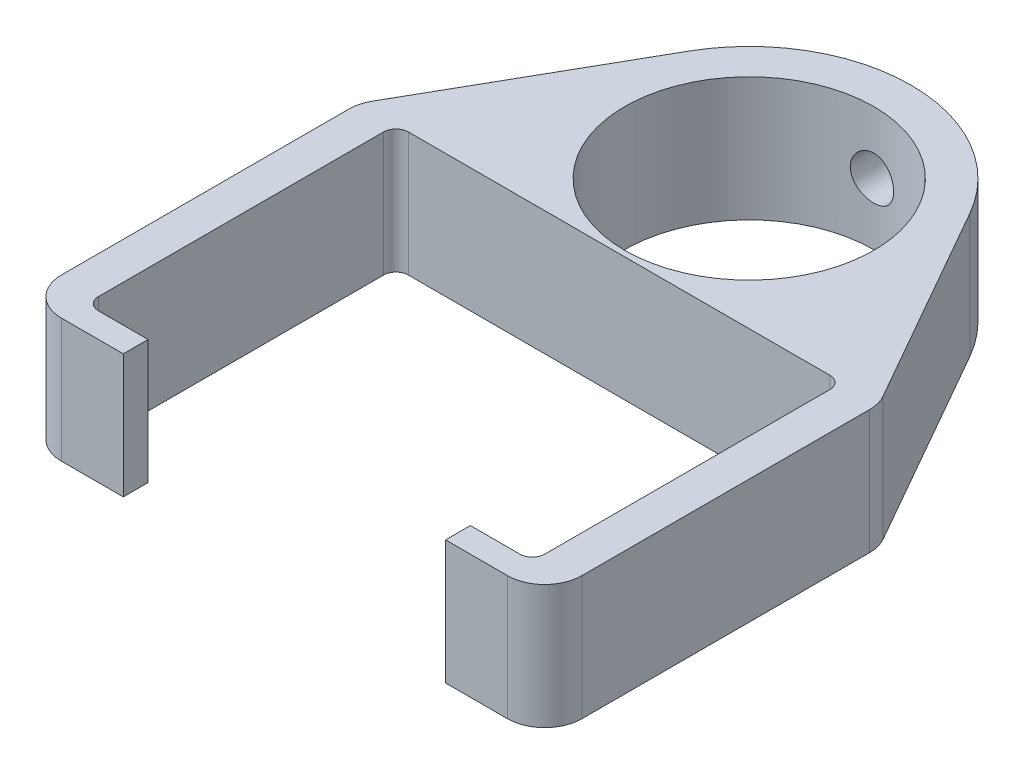
ISO-10303-21;
HEADER;
FILE_DESCRIPTION(('STEP AP214'),'2;1');
FILE_NAME('part.step','',(''),(''),'','','');
FILE_SCHEMA(('AUTOMOTIVE_DESIGN { 1 0 10303 214 1 1 1 1 }'));
ENDSEC;
DATA;
#1=APPLICATION_CONTEXT('core data for automotive mechanical design processes');
#2=APPLICATION_PROTOCOL_DEFINITION('international standard','automotive_design',2000,#1);
#3=PRODUCT_CONTEXT('',#1,'mechanical');
#4=PRODUCT('Part','Part','',(#3));
#5=PRODUCT_RELATED_PRODUCT_CATEGORY('part','',(#4));
#6=PRODUCT_DEFINITION_FORMATION('','',#4);
#7=PRODUCT_DEFINITION_CONTEXT('part definition',#1,'design');
#8=PRODUCT_DEFINITION('design','',#6,#7);
#9=PRODUCT_DEFINITION_SHAPE('','',#8);
#10=(LENGTH_UNIT() NAMED_UNIT(*) SI_UNIT(.MILLI.,.METRE.));
#11=(NAMED_UNIT(*) PLANE_ANGLE_UNIT() SI_UNIT($,.RADIAN.));
#12=(NAMED_UNIT(*) SI_UNIT($,.STERADIAN.) SOLID_ANGLE_UNIT());
#13=UNCERTAINTY_MEASURE_WITH_UNIT(LENGTH_MEASURE(1.E-05),#10,'distance_accuracy_value','');
#14=(GEOMETRIC_REPRESENTATION_CONTEXT(3) GLOBAL_UNCERTAINTY_ASSIGNED_CONTEXT((#13)) GLOBAL_UNIT_ASSIGNED_CONTEXT((#10,
#11,#12)) REPRESENTATION_CONTEXT('',''));
#15=CARTESIAN_POINT('',(0.,0.,0.));
#16=DIRECTION('',(0.,0.,1.));
#17=DIRECTION('',(1.,0.,0.));
#18=AXIS2_PLACEMENT_3D('',#15,#16,#17);
#19=CARTESIAN_POINT('',(18.,10.,0.));
#20=DIRECTION('',(1.,0.,0.));
#21=DIRECTION('',(0.,0.,-1.));
#22=AXIS2_PLACEMENT_3D('',#19,#20,#21);
#23=PLANE('',#22);
#24=DIRECTION('',(0.,0.,1.));
#25=VECTOR('',#24,1.);
#26=CARTESIAN_POINT('',(18.,0.,0.));
#27=LINE('',#26,#25);
#28=CARTESIAN_POINT('',(18.,0.,11.5));
#29=VERTEX_POINT('',#28);
#30=CARTESIAN_POINT('',(18.,0.,34.5));
#31=VERTEX_POINT('',#30);
#32=EDGE_CURVE('E324',#29,#31,#27,.T.);
#33=ORIENTED_EDGE('',*,*,#32,.T.);
#34=DIRECTION('',(0.,-1.,0.));
#35=VECTOR('',#34,1.);
#36=CARTESIAN_POINT('',(18.,10.,34.5));
#37=LINE('',#36,#35);
#38=CARTESIAN_POINT('',(18.,10.,34.5));
#39=VERTEX_POINT('',#38);
#40=EDGE_CURVE('E393',#31,#39,#37,.F.);
#41=ORIENTED_EDGE('',*,*,#40,.T.);
#42=DIRECTION('',(0.,0.,1.));
#43=VECTOR('',#42,1.);
#44=CARTESIAN_POINT('',(18.,10.,0.));
#45=LINE('',#44,#43);
#46=CARTESIAN_POINT('',(18.,10.,11.5));
#47=VERTEX_POINT('',#46);
#48=EDGE_CURVE('E291',#47,#39,#45,.T.);
#49=ORIENTED_EDGE('',*,*,#48,.F.);
#50=DIRECTION('',(0.,-1.,0.));
#51=VECTOR('',#50,1.);
#52=CARTESIAN_POINT('',(18.,0.,11.5));
#53=LINE('',#52,#51);
#54=EDGE_CURVE('E390',#47,#29,#53,.T.);
#55=ORIENTED_EDGE('',*,*,#54,.T.);
#56=EDGE_LOOP('',(#33,#41,#49,#55));
#57=FACE_BOUND('',#56,.T.);
#58=ADVANCED_FACE('F86',(#57),#23,.F.);
#59=CARTESIAN_POINT('',(21.,10.,0.));
#60=DIRECTION('',(1.,0.,0.));
#61=DIRECTION('',(0.,0.,-1.));
#62=AXIS2_PLACEMENT_3D('',#59,#60,#61);
#63=PLANE('',#62);
#64=DIRECTION('',(0.,0.,1.));
#65=VECTOR('',#64,1.);
#66=CARTESIAN_POINT('',(21.,10.,0.));
#67=LINE('',#66,#65);
#68=CARTESIAN_POINT('',(21.,10.,11.2945265569492));
#69=VERTEX_POINT('',#68);
#70=CARTESIAN_POINT('',(21.,10.,34.5));
#71=VERTEX_POINT('',#70);
#72=EDGE_CURVE('E255',#69,#71,#67,.T.);
#73=ORIENTED_EDGE('',*,*,#72,.T.);
#74=DIRECTION('',(0.,-1.,0.));
#75=VECTOR('',#74,1.);
#76=CARTESIAN_POINT('',(21.,10.,34.5));
#77=LINE('',#76,#75);
#78=CARTESIAN_POINT('',(21.,0.,34.5));
#79=VERTEX_POINT('',#78);
#80=EDGE_CURVE('E355',#71,#79,#77,.T.);
#81=ORIENTED_EDGE('',*,*,#80,.T.);
#82=DIRECTION('',(0.,0.,1.));
#83=VECTOR('',#82,1.);
#84=CARTESIAN_POINT('',(21.,0.,0.));
#85=LINE('',#84,#83);
#86=CARTESIAN_POINT('',(21.,0.,11.2945265569492));
#87=VERTEX_POINT('',#86);
#88=EDGE_CURVE('E300',#87,#79,#85,.T.);
#89=ORIENTED_EDGE('',*,*,#88,.F.);
#90=DIRECTION('',(0.,-1.,0.));
#91=VECTOR('',#90,1.);
#92=CARTESIAN_POINT('',(21.,10.,11.2945265569492));
#93=LINE('',#92,#91);
#94=EDGE_CURVE('E265',#87,#69,#93,.F.);
#95=ORIENTED_EDGE('',*,*,#94,.T.);
#96=EDGE_LOOP('',(#73,#81,#89,#95));
#97=FACE_BOUND('',#96,.T.);
#98=ADVANCED_FACE('F464',(#97),#63,.T.);
#99=CARTESIAN_POINT('',(11.3393007104556,10.,-6.45931570662559));
#100=DIRECTION('',(-0.868911931835682,0.,0.494966720814221));
#101=DIRECTION('',(0.494966720814221,0.,0.868911931835682));
#102=AXIS2_PLACEMENT_3D('',#99,#100,#101);
#103=PLANE('',#102);
#104=DIRECTION('',(-0.494966720814221,0.,-0.868911931835682));
#105=VECTOR('',#104,1.);
#106=CARTESIAN_POINT('',(11.3393007104556,10.,-6.45931570662559));
#107=LINE('',#106,#105);
#108=CARTESIAN_POINT('',(20.606735795507,10.,9.80962639450653));
#109=VERTEX_POINT('',#108);
#110=CARTESIAN_POINT('',(11.3393007104556,10.,-6.45931570662559));
#111=VERTEX_POINT('',#110);
#112=EDGE_CURVE('E240',#109,#111,#107,.T.);
#113=ORIENTED_EDGE('',*,*,#112,.F.);
#114=DIRECTION('',(0.,-1.,0.));
#115=VECTOR('',#114,1.);
#116=CARTESIAN_POINT('',(20.606735795507,0.,9.80962639450653));
#117=LINE('',#116,#115);
#118=CARTESIAN_POINT('',(20.606735795507,0.,9.80962639450653));
#119=VERTEX_POINT('',#118);
#120=EDGE_CURVE('E383',#109,#119,#117,.T.);
#121=ORIENTED_EDGE('',*,*,#120,.T.);
#122=DIRECTION('',(-0.494966720814221,0.,-0.868911931835682));
#123=VECTOR('',#122,1.);
#124=CARTESIAN_POINT('',(11.3393007104556,0.,-6.45931570662559));
#125=LINE('',#124,#123);
#126=CARTESIAN_POINT('',(11.3393007104556,0.,-6.45931570662559));
#127=VERTEX_POINT('',#126);
#128=EDGE_CURVE('E261',#119,#127,#125,.T.);
#129=ORIENTED_EDGE('',*,*,#128,.T.);
#130=DIRECTION('',(0.,-1.,0.));
#131=VECTOR('',#130,1.);
#132=CARTESIAN_POINT('',(11.3393007104556,10.,-6.45931570662559));
#133=LINE('',#132,#131);
#134=EDGE_CURVE('E258',#111,#127,#133,.T.);
#135=ORIENTED_EDGE('',*,*,#134,.F.);
#136=EDGE_LOOP('',(#113,#121,#129,#135));
#137=FACE_BOUND('',#136,.T.);
#138=ADVANCED_FACE('F259',(#137),#103,.F.);
#139=CARTESIAN_POINT('',(0.,10.,0.));
#140=DIRECTION('',(0.,-1.,0.));
#141=DIRECTION('',(0.,0.,-1.));
#142=AXIS2_PLACEMENT_3D('',#139,#140,#141);
#143=CYLINDRICAL_SURFACE('',#142,13.05);
#144=CARTESIAN_POINT('',(0.,3.25,-13.05));
#145=CARTESIAN_POINT('',(0.0978274017965709,3.25000411727674,-13.0499985563924));
#146=CARTESIAN_POINT('',(0.195714439800495,3.25823070004055,-13.0488883898653));
#147=CARTESIAN_POINT('',(0.388760454522384,3.29091590878211,-13.0445665203212));
#148=CARTESIAN_POINT('',(0.483916545257474,3.31539109129607,-13.0413526738031));
#149=CARTESIAN_POINT('',(0.668678315046049,3.37983583069083,-13.0331851953373));
#150=CARTESIAN_POINT('',(0.758287837663679,3.41979451546337,-13.0282327843927));
#151=CARTESIAN_POINT('',(0.92951350904582,3.51404720199481,-13.017137756471));
#152=CARTESIAN_POINT('',(1.01113093590114,3.56833890647693,-13.01099533027));
#153=CARTESIAN_POINT('',(1.16458562397635,3.69008166801,-12.9981618599946));
#154=CARTESIAN_POINT('',(1.23636526187491,3.75760506080751,-12.9914679230641));
#155=CARTESIAN_POINT('',(1.36761021823294,3.90373897923181,-12.9783089667916));
#156=CARTESIAN_POINT('',(1.42707488253316,3.98235009345475,-12.9718439596253));
#157=CARTESIAN_POINT('',(1.5322200474085,4.148807040605,-12.9598465684176));
#158=CARTESIAN_POINT('',(1.57784592653884,4.2366876682978,-12.954317917093));
#159=CARTESIAN_POINT('',(1.65366947077376,4.41895068503637,-12.9448579047174));
#160=CARTESIAN_POINT('',(1.68386780784691,4.51333279069775,-12.9409264740987));
#161=CARTESIAN_POINT('',(1.72780254414692,4.70531852783656,-12.9351339943286));
#162=CARTESIAN_POINT('',(1.74163675133164,4.80289939900467,-12.9332606489036));
#163=CARTESIAN_POINT('',(1.75275329817794,4.99901430170584,-12.9317589374786));
#164=CARTESIAN_POINT('',(1.75003640072308,5.09754828909828,-12.9321304680064));
#165=CARTESIAN_POINT('',(1.72820802453727,5.29208759906491,-12.9350652782109));
#166=CARTESIAN_POINT('',(1.70920469200651,5.38810530549202,-12.9376140997407));
#167=CARTESIAN_POINT('',(1.65551180644757,5.57557663636558,-12.9445937446439));
#168=CARTESIAN_POINT('',(1.62082189199352,5.6670301555972,-12.9490246113803));
#169=CARTESIAN_POINT('',(1.53662561936111,5.84311066925925,-12.9592853522852));
#170=CARTESIAN_POINT('',(1.48707267480534,5.92771512142058,-12.9651196136682));
#171=CARTESIAN_POINT('',(1.37459024170368,6.08744873107095,-12.9775264610578));
#172=CARTESIAN_POINT('',(1.31166004965398,6.1625773899008,-12.984099085886));
#173=CARTESIAN_POINT('',(1.17361209018969,6.30185418488781,-12.9973062362529));
#174=CARTESIAN_POINT('',(1.0984011858019,6.36591003471435,-13.0039408376434));
#175=CARTESIAN_POINT('',(0.938246324079525,6.48050295719231,-13.0164755103772));
#176=CARTESIAN_POINT('',(0.85330233814147,6.53103999011333,-13.0223755795617));
#177=CARTESIAN_POINT('',(0.676018364287251,6.61716238429306,-13.0327808809671));
#178=CARTESIAN_POINT('',(0.583675309433741,6.65274150687983,-13.0372855309784));
#179=CARTESIAN_POINT('',(0.394251517513212,6.70786247473842,-13.0443873280105));
#180=CARTESIAN_POINT('',(0.297171036250199,6.72740518490598,-13.0469845779027));
#181=CARTESIAN_POINT('',(0.101825596970832,6.74977790693332,-13.0499654790284));
#182=CARTESIAN_POINT('',(0.00357543564964264,6.75273495932226,-13.0503659562746));
#183=CARTESIAN_POINT('',(-0.192019134335603,6.74218835492154,-13.0489537469753));
#184=CARTESIAN_POINT('',(-0.289363565214478,6.72868510293126,-13.0471411148556));
#185=CARTESIAN_POINT('',(-0.480005147109601,6.68570677807283,-13.041516801374));
#186=CARTESIAN_POINT('',(-0.573316301055459,6.65629273369958,-13.037712760178));
#187=CARTESIAN_POINT('',(-0.753681878210108,6.58239154117193,-13.02853123152));
#188=CARTESIAN_POINT('',(-0.840736060070989,6.53790381196356,-13.0231536834043));
#189=CARTESIAN_POINT('',(-1.00668092740599,6.43481393524855,-13.0113820494466));
#190=CARTESIAN_POINT('',(-1.08552048104847,6.37613015467847,-13.0049821597743));
#191=CARTESIAN_POINT('',(-1.23227681255569,6.24642884481754,-12.9918987245024));
#192=CARTESIAN_POINT('',(-1.30019308830461,6.17541074886094,-12.9852151658812));
#193=CARTESIAN_POINT('',(-1.42362968666842,6.02249504889266,-12.9722652549825));
#194=CARTESIAN_POINT('',(-1.47906546353303,5.94052890272779,-12.9660019388115));
#195=CARTESIAN_POINT('',(-1.57538214282873,5.76837420161213,-12.9546529493295));
#196=CARTESIAN_POINT('',(-1.61626337337371,5.67818583207858,-12.9495672494714));
#197=CARTESIAN_POINT('',(-1.68217560615089,5.49241247067872,-12.9411704816567));
#198=CARTESIAN_POINT('',(-1.70725318139243,5.39684424852553,-12.9378542037258));
#199=CARTESIAN_POINT('',(-1.74099566574198,5.20280555624479,-12.9333572079728));
#200=CARTESIAN_POINT('',(-1.74966146370188,5.10433524358608,-12.9321763744965));
#201=CARTESIAN_POINT('',(-1.75031642878322,4.90812918545606,-12.9320876739287));
#202=CARTESIAN_POINT('',(-1.74243844912948,4.81039386528231,-12.9331616993896));
#203=CARTESIAN_POINT('',(-1.71051197355238,4.61765038598945,-12.9374226271253));
#204=CARTESIAN_POINT('',(-1.68646348447288,4.52264222571613,-12.9406095285059));
#205=CARTESIAN_POINT('',(-1.62292209009637,4.33807417469267,-12.9487312728053));
#206=CARTESIAN_POINT('',(-1.58343658746566,4.24851169627192,-12.9536652778111));
#207=CARTESIAN_POINT('',(-1.49015507277252,4.07726182378299,-12.9647265380302));
#208=CARTESIAN_POINT('',(-1.43635877522602,3.99557458686121,-12.9708538170472));
#209=CARTESIAN_POINT('',(-1.31549319923627,3.84171616916578,-12.9836700808909));
#210=CARTESIAN_POINT('',(-1.24832507820943,3.76962295828896,-12.9903630211887));
#211=CARTESIAN_POINT('',(-1.10283023224923,3.63768178269838,-13.003522196318));
#212=CARTESIAN_POINT('',(-1.02450089450814,3.57783669324818,-13.0099883776229));
#213=CARTESIAN_POINT('',(-0.85851019141404,3.47186341333461,-13.0219971273949));
#214=CARTESIAN_POINT('',(-0.770809540041309,3.42579631006841,-13.0275355360871));
#215=CARTESIAN_POINT('',(-0.588888569305102,3.34911127504897,-13.0370231811908));
#216=CARTESIAN_POINT('',(-0.494675344226775,3.31847682461564,-13.0409741158691));
#217=CARTESIAN_POINT('',(-0.333330013068885,3.2807290836903,-13.0459064574379));
#218=CARTESIAN_POINT('',(-0.267208467457925,3.26922259340307,-13.0474339196314));
#219=CARTESIAN_POINT('',(-0.134067280116707,3.25385667491345,-13.0494811810959));
#220=CARTESIAN_POINT('',(-0.0670476464432634,3.24999717815551,-13.0500009894006));
#221=CARTESIAN_POINT('',(0.,3.25,-13.05));
#222=B_SPLINE_CURVE_WITH_KNOTS('',3,(#144,#145,#146,#147,#148,#149,#150,#151,#152,#153,#154,
#155,#156,#157,#158,#159,#160,#161,#162,#163,#164,#165,#166,#167,#168,#169,#170,#171,#172,#173,
#174,#175,#176,#177,#178,#179,#180,#181,#182,#183,#184,#185,#186,#187,#188,#189,#190,#191,#192,
#193,#194,#195,#196,#197,#198,#199,#200,#201,#202,#203,#204,#205,#206,#207,#208,#209,#210,#211,
#212,#213,#214,#215,#216,#217,#218,#219,#220,#221),.UNSPECIFIED.,.T.,.F.,(4,2,2,2,2,2,2,2,2,2,2,
2,2,2,2,2,2,2,2,2,2,2,2,2,2,2,2,2,2,2,2,2,2,2,2,2,2,2,4),(0.,0.293237269596652,
0.586773793314364,0.880104575816512,1.17338837217571,1.46832264274902,1.76327257592389,
2.05937195987793,2.35545844570166,2.64976614182798,2.94406027264798,3.2364152215197,
3.52877690672337,3.82206471441829,4.11536794981299,4.4110087957341,4.7066505105033,
5.00241541000949,5.29816435690692,5.59164484074128,5.88511810731402,6.17747360874801,
6.46984038105926,6.76393010823039,7.05803335011035,7.35407267315811,7.65010532194988,
7.94526143873537,8.24040156958768,8.53318067238646,8.82595965127236,9.11859840278422,
9.41124299254371,9.70613695318201,10.0011000613844,10.2973521892932,10.5932865398468,
10.7942634101059,10.9952384785922),.UNSPECIFIED.);
#223=CARTESIAN_POINT('',(0.,3.25,-13.05));
#224=VERTEX_POINT('',#223);
#225=EDGE_CURVE('E347',#224,#224,#222,.T.);
#226=ORIENTED_EDGE('',*,*,#225,.T.);
#227=EDGE_LOOP('',(#226));
#228=FACE_BOUND('',#227,.T.);
#229=CARTESIAN_POINT('',(0.,0.,0.));
#230=DIRECTION('',(0.,1.,0.));
#231=DIRECTION('',(0.,0.,1.));
#232=AXIS2_PLACEMENT_3D('',#229,#230,#231);
#233=CIRCLE('',#232,13.05);
#234=CARTESIAN_POINT('',(-11.3393007104556,0.,-6.45931570662559));
#235=VERTEX_POINT('',#234);
#236=EDGE_CURVE('E305',#127,#235,#233,.T.);
#237=ORIENTED_EDGE('',*,*,#236,.T.);
#238=DIRECTION('',(0.,-1.,0.));
#239=VECTOR('',#238,1.);
#240=CARTESIAN_POINT('',(-11.3393007104556,10.,-6.45931570662559));
#241=LINE('',#240,#239);
#242=CARTESIAN_POINT('',(-11.3393007104556,10.,-6.45931570662559));
#243=VERTEX_POINT('',#242);
#244=EDGE_CURVE('E266',#243,#235,#241,.T.);
#245=ORIENTED_EDGE('',*,*,#244,.F.);
#246=CARTESIAN_POINT('',(0.,10.,0.));
#247=DIRECTION('',(0.,1.,0.));
#248=DIRECTION('',(0.,0.,1.));
#249=AXIS2_PLACEMENT_3D('',#246,#247,#248);
#250=CIRCLE('',#249,13.05);
#251=EDGE_CURVE('E247',#111,#243,#250,.T.);
#252=ORIENTED_EDGE('',*,*,#251,.F.);
#253=ORIENTED_EDGE('',*,*,#134,.T.);
#254=EDGE_LOOP('',(#237,#245,#252,#253));
#255=FACE_BOUND('',#254,.T.);
#256=ADVANCED_FACE('F268',(#228,#255),#143,.T.);
#257=CARTESIAN_POINT('',(-11.3393007104556,10.,-6.45931570662559));
#258=DIRECTION('',(-0.868911931835682,0.,-0.494966720814221));
#259=DIRECTION('',(-0.494966720814221,0.,0.868911931835682));
#260=AXIS2_PLACEMENT_3D('',#257,#258,#259);
#261=PLANE('',#260);
#262=DIRECTION('',(0.494966720814221,0.,-0.868911931835682));
#263=VECTOR('',#262,1.);
#264=CARTESIAN_POINT('',(-11.3393007104556,0.,-6.45931570662559));
#265=LINE('',#264,#263);
#266=CARTESIAN_POINT('',(-20.606735795507,0.,9.80962639450653));
#267=VERTEX_POINT('',#266);
#268=EDGE_CURVE('E307',#267,#235,#265,.T.);
#269=ORIENTED_EDGE('',*,*,#268,.F.);
#270=DIRECTION('',(0.,-1.,0.));
#271=VECTOR('',#270,1.);
#272=CARTESIAN_POINT('',(-20.606735795507,10.,9.80962639450653));
#273=LINE('',#272,#271);
#274=CARTESIAN_POINT('',(-20.606735795507,10.,9.80962639450653));
#275=VERTEX_POINT('',#274);
#276=EDGE_CURVE('E385',#267,#275,#273,.F.);
#277=ORIENTED_EDGE('',*,*,#276,.T.);
#278=DIRECTION('',(0.494966720814221,0.,-0.868911931835682));
#279=VECTOR('',#278,1.);
#280=CARTESIAN_POINT('',(-11.3393007104556,10.,-6.45931570662559));
#281=LINE('',#280,#279);
#282=EDGE_CURVE('E270',#275,#243,#281,.T.);
#283=ORIENTED_EDGE('',*,*,#282,.T.);
#284=ORIENTED_EDGE('',*,*,#244,.T.);
#285=EDGE_LOOP('',(#269,#277,#283,#284));
#286=FACE_BOUND('',#285,.T.);
#287=ADVANCED_FACE('F514',(#286),#261,.T.);
#288=CARTESIAN_POINT('',(-21.,10.,0.));
#289=DIRECTION('',(1.,0.,0.));
#290=DIRECTION('',(0.,0.,-1.));
#291=AXIS2_PLACEMENT_3D('',#288,#289,#290);
#292=PLANE('',#291);
#293=DIRECTION('',(0.,0.,1.));
#294=VECTOR('',#293,1.);
#295=CARTESIAN_POINT('',(-21.,0.,0.));
#296=LINE('',#295,#294);
#297=CARTESIAN_POINT('',(-21.,0.,11.2945265569492));
#298=VERTEX_POINT('',#297);
#299=CARTESIAN_POINT('',(-21.,0.,34.5));
#300=VERTEX_POINT('',#299);
#301=EDGE_CURVE('E309',#298,#300,#296,.T.);
#302=ORIENTED_EDGE('',*,*,#301,.T.);
#303=DIRECTION('',(0.,-1.,0.));
#304=VECTOR('',#303,1.);
#305=CARTESIAN_POINT('',(-21.,10.,34.5));
#306=LINE('',#305,#304);
#307=CARTESIAN_POINT('',(-21.,10.,34.5));
#308=VERTEX_POINT('',#307);
#309=EDGE_CURVE('E381',#300,#308,#306,.F.);
#310=ORIENTED_EDGE('',*,*,#309,.T.);
#311=DIRECTION('',(0.,0.,1.));
#312=VECTOR('',#311,1.);
#313=CARTESIAN_POINT('',(-21.,10.,0.));
#314=LINE('',#313,#312);
#315=CARTESIAN_POINT('',(-21.,10.,11.2945265569492));
#316=VERTEX_POINT('',#315);
#317=EDGE_CURVE('E272',#316,#308,#314,.T.);
#318=ORIENTED_EDGE('',*,*,#317,.F.);
#319=DIRECTION('',(0.,-1.,0.));
#320=VECTOR('',#319,1.);
#321=CARTESIAN_POINT('',(-21.,0.,11.2945265569492));
#322=LINE('',#321,#320);
#323=EDGE_CURVE('E378',#316,#298,#322,.T.);
#324=ORIENTED_EDGE('',*,*,#323,.T.);
#325=EDGE_LOOP('',(#302,#310,#318,#324));
#326=FACE_BOUND('',#325,.T.);
#327=ADVANCED_FACE('F511',(#326),#292,.F.);
#328=CARTESIAN_POINT('',(0.,10.,37.5));
#329=DIRECTION('',(0.,0.,-1.));
#330=DIRECTION('',(-1.,0.,0.));
#331=AXIS2_PLACEMENT_3D('',#328,#329,#330);
#332=PLANE('',#331);
#333=DIRECTION('',(1.,0.,0.));
#334=VECTOR('',#333,1.);
#335=CARTESIAN_POINT('',(0.,10.,37.5));
#336=LINE('',#335,#334);
#337=CARTESIAN_POINT('',(-18.,10.,37.5));
#338=VERTEX_POINT('',#337);
#339=CARTESIAN_POINT('',(-13.,10.,37.5));
#340=VERTEX_POINT('',#339);
#341=EDGE_CURVE('E278',#338,#340,#336,.T.);
#342=ORIENTED_EDGE('',*,*,#341,.F.);
#343=DIRECTION('',(0.,-1.,0.));
#344=VECTOR('',#343,1.);
#345=CARTESIAN_POINT('',(-18.,10.,37.5));
#346=LINE('',#345,#344);
#347=CARTESIAN_POINT('',(-18.,0.,37.5));
#348=VERTEX_POINT('',#347);
#349=EDGE_CURVE('E375',#338,#348,#346,.T.);
#350=ORIENTED_EDGE('',*,*,#349,.T.);
#351=DIRECTION('',(1.,0.,0.));
#352=VECTOR('',#351,1.);
#353=CARTESIAN_POINT('',(0.,0.,37.5));
#354=LINE('',#353,#352);
#355=CARTESIAN_POINT('',(-13.,0.,37.5));
#356=VERTEX_POINT('',#355);
#357=EDGE_CURVE('E312',#348,#356,#354,.T.);
#358=ORIENTED_EDGE('',*,*,#357,.T.);
#359=DIRECTION('',(0.,-1.,0.));
#360=VECTOR('',#359,1.);
#361=CARTESIAN_POINT('',(-13.,10.,37.5));
#362=LINE('',#361,#360);
#363=EDGE_CURVE('E334',#340,#356,#362,.T.);
#364=ORIENTED_EDGE('',*,*,#363,.F.);
#365=EDGE_LOOP('',(#342,#350,#358,#364));
#366=FACE_BOUND('',#365,.T.);
#367=ADVANCED_FACE('F507',(#366),#332,.F.);
#368=CARTESIAN_POINT('',(-13.,10.,0.));
#369=DIRECTION('',(-1.,0.,0.));
#370=DIRECTION('',(0.,0.,1.));
#371=AXIS2_PLACEMENT_3D('',#368,#369,#370);
#372=PLANE('',#371);
#373=DIRECTION('',(0.,0.,-1.));
#374=VECTOR('',#373,1.);
#375=CARTESIAN_POINT('',(-13.,0.,0.));
#376=LINE('',#375,#374);
#377=CARTESIAN_POINT('',(-13.,0.,35.5));
#378=VERTEX_POINT('',#377);
#379=EDGE_CURVE('E314',#356,#378,#376,.T.);
#380=ORIENTED_EDGE('',*,*,#379,.T.);
#381=DIRECTION('',(0.,-1.,0.));
#382=VECTOR('',#381,1.);
#383=CARTESIAN_POINT('',(-13.,10.,35.5));
#384=LINE('',#383,#382);
#385=CARTESIAN_POINT('',(-13.,10.,35.5));
#386=VERTEX_POINT('',#385);
#387=EDGE_CURVE('E299',#386,#378,#384,.T.);
#388=ORIENTED_EDGE('',*,*,#387,.F.);
#389=DIRECTION('',(0.,0.,-1.));
#390=VECTOR('',#389,1.);
#391=CARTESIAN_POINT('',(-13.,10.,0.));
#392=LINE('',#391,#390);
#393=EDGE_CURVE('E280',#340,#386,#392,.T.);
#394=ORIENTED_EDGE('',*,*,#393,.F.);
#395=ORIENTED_EDGE('',*,*,#363,.T.);
#396=EDGE_LOOP('',(#380,#388,#394,#395));
#397=FACE_BOUND('',#396,.T.);
#398=ADVANCED_FACE('F504',(#397),#372,.F.);
#399=CARTESIAN_POINT('',(0.,10.,35.5));
#400=DIRECTION('',(0.,0.,-1.));
#401=DIRECTION('',(-1.,0.,0.));
#402=AXIS2_PLACEMENT_3D('',#399,#400,#401);
#403=PLANE('',#402);
#404=DIRECTION('',(1.,0.,0.));
#405=VECTOR('',#404,1.);
#406=CARTESIAN_POINT('',(0.,0.,35.5));
#407=LINE('',#406,#405);
#408=CARTESIAN_POINT('',(-17.,0.,35.5));
#409=VERTEX_POINT('',#408);
#410=EDGE_CURVE('E317',#409,#378,#407,.T.);
#411=ORIENTED_EDGE('',*,*,#410,.F.);
#412=DIRECTION('',(0.,-1.,0.));
#413=VECTOR('',#412,1.);
#414=CARTESIAN_POINT('',(-17.,10.,35.5));
#415=LINE('',#414,#413);
#416=CARTESIAN_POINT('',(-17.,10.,35.5));
#417=VERTEX_POINT('',#416);
#418=EDGE_CURVE('E107',#409,#417,#415,.F.);
#419=ORIENTED_EDGE('',*,*,#418,.T.);
#420=DIRECTION('',(1.,0.,0.));
#421=VECTOR('',#420,1.);
#422=CARTESIAN_POINT('',(0.,10.,35.5));
#423=LINE('',#422,#421);
#424=EDGE_CURVE('E283',#417,#386,#423,.T.);
#425=ORIENTED_EDGE('',*,*,#424,.T.);
#426=ORIENTED_EDGE('',*,*,#387,.T.);
#427=EDGE_LOOP('',(#411,#419,#425,#426));
#428=FACE_BOUND('',#427,.T.);
#429=ADVANCED_FACE('F501',(#428),#403,.T.);
#430=CARTESIAN_POINT('',(-18.,10.,0.));
#431=DIRECTION('',(1.,0.,0.));
#432=DIRECTION('',(0.,0.,-1.));
#433=AXIS2_PLACEMENT_3D('',#430,#431,#432);
#434=PLANE('',#433);
#435=DIRECTION('',(0.,0.,1.));
#436=VECTOR('',#435,1.);
#437=CARTESIAN_POINT('',(-18.,10.,0.));
#438=LINE('',#437,#436);
#439=CARTESIAN_POINT('',(-18.,10.,11.5));
#440=VERTEX_POINT('',#439);
#441=CARTESIAN_POINT('',(-18.,10.,34.5));
#442=VERTEX_POINT('',#441);
#443=EDGE_CURVE('E285',#440,#442,#438,.T.);
#444=ORIENTED_EDGE('',*,*,#443,.T.);
#445=DIRECTION('',(0.,-1.,0.));
#446=VECTOR('',#445,1.);
#447=CARTESIAN_POINT('',(-18.,0.,34.5));
#448=LINE('',#447,#446);
#449=CARTESIAN_POINT('',(-18.,0.,34.5));
#450=VERTEX_POINT('',#449);
#451=EDGE_CURVE('E402',#442,#450,#448,.T.);
#452=ORIENTED_EDGE('',*,*,#451,.T.);
#453=DIRECTION('',(0.,0.,1.));
#454=VECTOR('',#453,1.);
#455=CARTESIAN_POINT('',(-18.,0.,0.));
#456=LINE('',#455,#454);
#457=CARTESIAN_POINT('',(-18.,0.,11.5));
#458=VERTEX_POINT('',#457);
#459=EDGE_CURVE('E319',#458,#450,#456,.T.);
#460=ORIENTED_EDGE('',*,*,#459,.F.);
#461=DIRECTION('',(0.,-1.,0.));
#462=VECTOR('',#461,1.);
#463=CARTESIAN_POINT('',(-18.,10.,11.5));
#464=LINE('',#463,#462);
#465=EDGE_CURVE('E400',#458,#440,#464,.F.);
#466=ORIENTED_EDGE('',*,*,#465,.T.);
#467=EDGE_LOOP('',(#444,#452,#460,#466));
#468=FACE_BOUND('',#467,.T.);
#469=ADVANCED_FACE('F425',(#468),#434,.T.);
#470=CARTESIAN_POINT('',(0.,10.,10.5));
#471=DIRECTION('',(0.,0.,-1.));
#472=DIRECTION('',(-1.,0.,0.));
#473=AXIS2_PLACEMENT_3D('',#470,#471,#472);
#474=PLANE('',#473);
#475=DIRECTION('',(1.,0.,0.));
#476=VECTOR('',#475,1.);
#477=CARTESIAN_POINT('',(0.,0.,10.5));
#478=LINE('',#477,#476);
#479=CARTESIAN_POINT('',(-17.,0.,10.5));
#480=VERTEX_POINT('',#479);
#481=CARTESIAN_POINT('',(17.,0.,10.5));
#482=VERTEX_POINT('',#481);
#483=EDGE_CURVE('E321',#480,#482,#478,.T.);
#484=ORIENTED_EDGE('',*,*,#483,.T.);
#485=DIRECTION('',(0.,-1.,0.));
#486=VECTOR('',#485,1.);
#487=CARTESIAN_POINT('',(17.,10.,10.5));
#488=LINE('',#487,#486);
#489=CARTESIAN_POINT('',(17.,10.,10.5));
#490=VERTEX_POINT('',#489);
#491=EDGE_CURVE('E398',#482,#490,#488,.F.);
#492=ORIENTED_EDGE('',*,*,#491,.T.);
#493=DIRECTION('',(1.,0.,0.));
#494=VECTOR('',#493,1.);
#495=CARTESIAN_POINT('',(0.,10.,10.5));
#496=LINE('',#495,#494);
#497=CARTESIAN_POINT('',(-17.,10.,10.5));
#498=VERTEX_POINT('',#497);
#499=EDGE_CURVE('E288',#498,#490,#496,.T.);
#500=ORIENTED_EDGE('',*,*,#499,.F.);
#501=DIRECTION('',(0.,-1.,0.));
#502=VECTOR('',#501,1.);
#503=CARTESIAN_POINT('',(-17.,10.,10.5));
#504=LINE('',#503,#502);
#505=EDGE_CURVE('E395',#498,#480,#504,.T.);
#506=ORIENTED_EDGE('',*,*,#505,.T.);
#507=EDGE_LOOP('',(#484,#492,#500,#506));
#508=FACE_BOUND('',#507,.T.);
#509=ADVANCED_FACE('F432',(#508),#474,.F.);
#510=CARTESIAN_POINT('',(0.,10.,37.5));
#511=DIRECTION('',(0.,0.,1.));
#512=DIRECTION('',(1.,0.,0.));
#513=AXIS2_PLACEMENT_3D('',#510,#511,#512);
#514=PLANE('',#513);
#515=DIRECTION('',(-1.,0.,0.));
#516=VECTOR('',#515,1.);
#517=CARTESIAN_POINT('',(0.,0.,37.5));
#518=LINE('',#517,#516);
#519=CARTESIAN_POINT('',(18.,0.,37.5));
#520=VERTEX_POINT('',#519);
#521=CARTESIAN_POINT('',(13.,0.,37.5));
#522=VERTEX_POINT('',#521);
#523=EDGE_CURVE('E327',#520,#522,#518,.T.);
#524=ORIENTED_EDGE('',*,*,#523,.F.);
#525=DIRECTION('',(0.,-1.,0.));
#526=VECTOR('',#525,1.);
#527=CARTESIAN_POINT('',(18.,10.,37.5));
#528=LINE('',#527,#526);
#529=CARTESIAN_POINT('',(18.,10.,37.5));
#530=VERTEX_POINT('',#529);
#531=EDGE_CURVE('E366',#520,#530,#528,.F.);
#532=ORIENTED_EDGE('',*,*,#531,.T.);
#533=DIRECTION('',(-1.,0.,0.));
#534=VECTOR('',#533,1.);
#535=CARTESIAN_POINT('',(0.,10.,37.5));
#536=LINE('',#535,#534);
#537=CARTESIAN_POINT('',(13.,10.,37.5));
#538=VERTEX_POINT('',#537);
#539=EDGE_CURVE('E294',#530,#538,#536,.T.);
#540=ORIENTED_EDGE('',*,*,#539,.T.);
#541=DIRECTION('',(0.,-1.,0.));
#542=VECTOR('',#541,1.);
#543=CARTESIAN_POINT('',(13.,10.,37.5));
#544=LINE('',#543,#542);
#545=EDGE_CURVE('E344',#538,#522,#544,.T.);
#546=ORIENTED_EDGE('',*,*,#545,.T.);
#547=EDGE_LOOP('',(#524,#532,#540,#546));
#548=FACE_BOUND('',#547,.T.);
#549=ADVANCED_FACE('F491',(#548),#514,.T.);
#550=CARTESIAN_POINT('',(0.,10.,0.));
#551=DIRECTION('',(0.,-1.,0.));
#552=DIRECTION('',(0.,0.,-1.));
#553=AXIS2_PLACEMENT_3D('',#550,#551,#552);
#554=CYLINDRICAL_SURFACE('',#553,10.05);
#555=CARTESIAN_POINT('',(0.,6.75,-10.05));
#556=CARTESIAN_POINT('',(-0.0975080492346213,6.74999614995466,-10.0499982896163));
#557=CARTESIAN_POINT('',(-0.19506768498346,6.74182290596818,-10.048566185362));
#558=CARTESIAN_POINT('',(-0.387446244557423,6.70936204203934,-10.0429911849368));
#559=CARTESIAN_POINT('',(-0.48226264053044,6.68506002413086,-10.0388458667576));
#560=CARTESIAN_POINT('',(-0.666343948523187,6.62110133223813,-10.0283089615896));
#561=CARTESIAN_POINT('',(-0.755613491609107,6.58145767246134,-10.0219192789028));
#562=CARTESIAN_POINT('',(-0.926223642564088,6.48797612772153,-10.0075945407644));
#563=CARTESIAN_POINT('',(-1.00756506387441,6.43413970106927,-9.99965964410597));
#564=CARTESIAN_POINT('',(-1.16086593688849,6.31320589091188,-9.98303055703897));
#565=CARTESIAN_POINT('',(-1.23273101460357,6.24598973954906,-9.97432998663465));
#566=CARTESIAN_POINT('',(-1.36422357604716,6.10046010099779,-9.95719847613314));
#567=CARTESIAN_POINT('',(-1.42385025183916,6.02214588173023,-9.94876755386817));
#568=CARTESIAN_POINT('',(-1.52955662571841,5.85598836175812,-9.93306807785863));
#569=CARTESIAN_POINT('',(-1.5755420688313,5.76808425120315,-9.92580776278396));
#570=CARTESIAN_POINT('',(-1.6520576590636,5.58565132001084,-9.91336056678793));
#571=CARTESIAN_POINT('',(-1.68258894881693,5.49112298973703,-9.90817353258035));
#572=CARTESIAN_POINT('',(-1.72703027912823,5.29912868387344,-9.90052396795737));
#573=CARTESIAN_POINT('',(-1.7411038387046,5.20170164608097,-9.89803465233592));
#574=CARTESIAN_POINT('',(-1.75273740025284,5.0058396683238,-9.89598144912296));
#575=CARTESIAN_POINT('',(-1.7502986779704,4.90740480681069,-9.89641733552912));
#576=CARTESIAN_POINT('',(-1.72910988592802,4.71349462914588,-9.9001408542765));
#577=CARTESIAN_POINT('',(-1.71054427680749,4.61799844687775,-9.90339623577698));
#578=CARTESIAN_POINT('',(-1.65791855314059,4.43149739040649,-9.91234140325852));
#579=CARTESIAN_POINT('',(-1.62385786300188,4.34049268318639,-9.91803127967275));
#580=CARTESIAN_POINT('',(-1.54102411651828,4.16500997050172,-9.93123878271003));
#581=CARTESIAN_POINT('',(-1.49217519512239,4.08056851134007,-9.93876579448384));
#582=CARTESIAN_POINT('',(-1.38120541698475,3.92101114792242,-9.95479305912909));
#583=CARTESIAN_POINT('',(-1.31908339346092,3.84589606442694,-9.96329339753104));
#584=CARTESIAN_POINT('',(-1.1823294152795,3.70605661871728,-9.98045084776868));
#585=CARTESIAN_POINT('',(-1.10753936161785,3.64148683657968,-9.98910852323367));
#586=CARTESIAN_POINT('',(-0.948105070652427,3.52578903846948,-10.0054988990485));
#587=CARTESIAN_POINT('',(-0.863460758602254,3.47466112446557,-10.0132315923813));
#588=CARTESIAN_POINT('',(-0.686569867309046,3.38728134490152,-10.0269132436078));
#589=CARTESIAN_POINT('',(-0.594315987426213,3.35104396946074,-10.0328604625316));
#590=CARTESIAN_POINT('',(-0.404904567315679,3.29462177716478,-10.0422873149106));
#591=CARTESIAN_POINT('',(-0.307747476235807,3.27443549281304,-10.045767173945));
#592=CARTESIAN_POINT('',(-0.112619057257022,3.2508999819944,-10.0498366630669));
#593=CARTESIAN_POINT('',(-0.0146740407781443,3.24733869204709,-10.0504626933083));
#594=CARTESIAN_POINT('',(0.180412676485635,3.25658769535651,-10.0488539792727));
#595=CARTESIAN_POINT('',(0.277554410941471,3.2693972988623,-10.0466193555229));
#596=CARTESIAN_POINT('',(0.467615958803308,3.31084810148475,-10.0395629953403));
#597=CARTESIAN_POINT('',(0.560559541647792,3.33938351128146,-10.0347585526632));
#598=CARTESIAN_POINT('',(0.740343541492987,3.41136254843353,-10.0230990390872));
#599=CARTESIAN_POINT('',(0.827183589805304,3.45480707545395,-10.0162438444424));
#600=CARTESIAN_POINT('',(0.993211048884294,3.55585115433199,-10.0011526935002));
#601=CARTESIAN_POINT('',(1.07231727943034,3.61358217838759,-9.99290415232079));
#602=CARTESIAN_POINT('',(1.21979493040584,3.74138065405715,-9.97597717895522));
#603=CARTESIAN_POINT('',(1.2881654941053,3.81144908927828,-9.96729871253267));
#604=CARTESIAN_POINT('',(1.41302395137492,3.96288768829063,-9.95037123958944));
#605=CARTESIAN_POINT('',(1.46936805288499,4.04437718421407,-9.94212823083395));
#606=CARTESIAN_POINT('',(1.56756762929854,4.21578901270125,-9.92711990972601));
#607=CARTESIAN_POINT('',(1.60942359289985,4.30571106069742,-9.92035454753406));
#608=CARTESIAN_POINT('',(1.67724752977425,4.49104618287469,-9.90911324365576));
#609=CARTESIAN_POINT('',(1.70328511416777,4.58643314734654,-9.90462728560292));
#610=CARTESIAN_POINT('',(1.73895083667758,4.78031203893479,-9.89842832921953));
#611=CARTESIAN_POINT('',(1.74858054584408,4.87880366786043,-9.89671506540494));
#612=CARTESIAN_POINT('',(1.75111030225916,5.07465874910865,-9.89626763060476));
#613=CARTESIAN_POINT('',(1.74423683640005,5.17201925729769,-9.89749312824707));
#614=CARTESIAN_POINT('',(1.71444720604612,5.36417538509738,-9.90269638384861));
#615=CARTESIAN_POINT('',(1.69153110775159,5.45897101529038,-9.90667413045061));
#616=CARTESIAN_POINT('',(1.63039657527981,5.64320704804489,-9.91691778656645));
#617=CARTESIAN_POINT('',(1.59219938488435,5.73265468777516,-9.92318051843343));
#618=CARTESIAN_POINT('',(1.50161068561128,5.90390855508476,-9.9372912599205));
#619=CARTESIAN_POINT('',(1.4492183679388,5.98571434689775,-9.94513935986352));
#620=CARTESIAN_POINT('',(1.33092550784986,6.14050332710651,-9.96166350656832));
#621=CARTESIAN_POINT('',(1.26485894033763,6.21335865187418,-9.97034895292114));
#622=CARTESIAN_POINT('',(1.12144190810204,6.34702574522468,-9.9874958269095));
#623=CARTESIAN_POINT('',(1.04408884872981,6.40783473687971,-9.99595720250357));
#624=CARTESIAN_POINT('',(0.879592577705312,6.51610957834092,-10.0117775535053));
#625=CARTESIAN_POINT('',(0.792379334602255,6.56347035189165,-10.0191276484779));
#626=CARTESIAN_POINT('',(0.611139411810856,6.64279463361762,-10.031810863116));
#627=CARTESIAN_POINT('',(0.517119489457774,6.67477317775624,-10.0371459513282));
#628=CARTESIAN_POINT('',(0.352303056521071,6.71563772451069,-10.0440600100304));
#629=CARTESIAN_POINT('',(0.282492671360269,6.72850247025652,-10.0462753702562));
#630=CARTESIAN_POINT('',(0.141797271028173,6.74568492319217,-10.0492459726933));
#631=CARTESIAN_POINT('',(0.0709122772021799,6.75000279992764,-10.0500012438686));
#632=CARTESIAN_POINT('',(0.,6.75,-10.05));
#633=B_SPLINE_CURVE_WITH_KNOTS('',3,(#555,#556,#557,#558,#559,#560,#561,#562,#563,#564,#565,
#566,#567,#568,#569,#570,#571,#572,#573,#574,#575,#576,#577,#578,#579,#580,#581,#582,#583,#584,
#585,#586,#587,#588,#589,#590,#591,#592,#593,#594,#595,#596,#597,#598,#599,#600,#601,#602,#603,
#604,#605,#606,#607,#608,#609,#610,#611,#612,#613,#614,#615,#616,#617,#618,#619,#620,#621,#622,
#623,#624,#625,#626,#627,#628,#629,#630,#631,#632),.UNSPECIFIED.,.T.,.F.,(4,2,2,2,2,2,2,2,2,2,2,
2,2,2,2,2,2,2,2,2,2,2,2,2,2,2,2,2,2,2,2,2,2,2,2,2,2,2,4),(0.,0.29226490022414,0.58479105343477,
0.877069600790277,1.16931812814025,1.46428688566632,1.75927510974007,2.05625648020861,
2.35321588955334,2.64719903375654,2.94115946496031,3.23180117850611,3.52245368933697,
3.81462329692551,4.10681859847884,4.40297301671345,4.69912968148154,4.99557386039815,
5.29199093331643,5.58461647471115,5.87722968739043,6.16789806933444,6.45858399424777,
6.75205151015421,7.0455424335291,7.34236701478608,7.63918158290929,7.93468033013568,
8.23015078183587,8.52158947511609,8.8130269657749,9.10406070003368,9.3951110199914,
9.68992756523924,9.9848119928889,10.2819407673355,10.5787785084028,10.7913310199621,
11.0038793150397),.UNSPECIFIED.);
#634=CARTESIAN_POINT('',(0.,6.75,-10.05));
#635=VERTEX_POINT('',#634);
#636=EDGE_CURVE('E90',#635,#635,#633,.T.);
#637=ORIENTED_EDGE('',*,*,#636,.F.);
#638=EDGE_LOOP('',(#637));
#639=FACE_BOUND('',#638,.T.);
#640=CARTESIAN_POINT('',(0.,10.,0.));
#641=DIRECTION('',(0.,1.,0.));
#642=DIRECTION('',(0.,0.,1.));
#643=AXIS2_PLACEMENT_3D('',#640,#641,#642);
#644=CIRCLE('',#643,10.05);
#645=CARTESIAN_POINT('',(0.,10.,10.05));
#646=VERTEX_POINT('',#645);
#647=EDGE_CURVE('E296',#646,#646,#644,.T.);
#648=ORIENTED_EDGE('',*,*,#647,.T.);
#649=EDGE_LOOP('',(#648));
#650=FACE_BOUND('',#649,.T.);
#651=CARTESIAN_POINT('',(0.,0.,0.));
#652=DIRECTION('',(0.,1.,0.));
#653=DIRECTION('',(0.,0.,1.));
#654=AXIS2_PLACEMENT_3D('',#651,#652,#653);
#655=CIRCLE('',#654,10.05);
#656=CARTESIAN_POINT('',(0.,0.,10.05));
#657=VERTEX_POINT('',#656);
#658=EDGE_CURVE('E329',#657,#657,#655,.T.);
#659=ORIENTED_EDGE('',*,*,#658,.F.);
#660=EDGE_LOOP('',(#659));
#661=FACE_BOUND('',#660,.T.);
#662=ADVANCED_FACE('F486',(#639,#650,#661),#554,.F.);
#663=CARTESIAN_POINT('',(0.,10.,0.));
#664=DIRECTION('',(0.,1.,0.));
#665=DIRECTION('',(0.,0.,1.));
#666=AXIS2_PLACEMENT_3D('',#663,#664,#665);
#667=PLANE('',#666);
#668=ORIENTED_EDGE('',*,*,#539,.F.);
#669=CARTESIAN_POINT('',(18.,10.,34.5));
#670=DIRECTION('',(0.,1.,0.));
#671=DIRECTION('',(0.,0.,1.));
#672=AXIS2_PLACEMENT_3D('',#669,#670,#671);
#673=CIRCLE('',#672,3.);
#674=EDGE_CURVE('E373',#530,#71,#673,.T.);
#675=ORIENTED_EDGE('',*,*,#674,.T.);
#676=ORIENTED_EDGE('',*,*,#72,.F.);
#677=CARTESIAN_POINT('',(18.,10.,11.2945265569492));
#678=DIRECTION('',(0.,1.,0.));
#679=DIRECTION('',(0.,0.,1.));
#680=AXIS2_PLACEMENT_3D('',#677,#678,#679);
#681=CIRCLE('',#680,3.);
#682=EDGE_CURVE('E251',#69,#109,#681,.T.);
#683=ORIENTED_EDGE('',*,*,#682,.T.);
#684=ORIENTED_EDGE('',*,*,#112,.T.);
#685=ORIENTED_EDGE('',*,*,#251,.T.);
#686=ORIENTED_EDGE('',*,*,#282,.F.);
#687=CARTESIAN_POINT('',(-18.,10.,11.2945265569492));
#688=DIRECTION('',(0.,1.,0.));
#689=DIRECTION('',(0.,0.,1.));
#690=AXIS2_PLACEMENT_3D('',#687,#688,#689);
#691=CIRCLE('',#690,3.);
#692=EDGE_CURVE('E368',#275,#316,#691,.T.);
#693=ORIENTED_EDGE('',*,*,#692,.T.);
#694=ORIENTED_EDGE('',*,*,#317,.T.);
#695=CARTESIAN_POINT('',(-18.,10.,34.5));
#696=DIRECTION('',(0.,1.,0.));
#697=DIRECTION('',(0.,0.,1.));
#698=AXIS2_PLACEMENT_3D('',#695,#696,#697);
#699=CIRCLE('',#698,3.);
#700=EDGE_CURVE('E371',#308,#338,#699,.T.);
#701=ORIENTED_EDGE('',*,*,#700,.T.);
#702=ORIENTED_EDGE('',*,*,#341,.T.);
#703=ORIENTED_EDGE('',*,*,#393,.T.);
#704=ORIENTED_EDGE('',*,*,#424,.F.);
#705=CARTESIAN_POINT('',(-17.,10.,34.5));
#706=DIRECTION('',(0.,1.,0.));
#707=DIRECTION('',(0.,0.,1.));
#708=AXIS2_PLACEMENT_3D('',#705,#706,#707);
#709=CIRCLE('',#708,1.);
#710=EDGE_CURVE('E415',#417,#442,#709,.F.);
#711=ORIENTED_EDGE('',*,*,#710,.T.);
#712=ORIENTED_EDGE('',*,*,#443,.F.);
#713=CARTESIAN_POINT('',(-17.,10.,11.5));
#714=DIRECTION('',(0.,1.,0.));
#715=DIRECTION('',(0.,0.,1.));
#716=AXIS2_PLACEMENT_3D('',#713,#714,#715);
#717=CIRCLE('',#716,1.);
#718=EDGE_CURVE('E12',#440,#498,#717,.F.);
#719=ORIENTED_EDGE('',*,*,#718,.T.);
#720=ORIENTED_EDGE('',*,*,#499,.T.);
#721=CARTESIAN_POINT('',(17.,10.,11.5));
#722=DIRECTION('',(0.,1.,0.));
#723=DIRECTION('',(0.,0.,1.));
#724=AXIS2_PLACEMENT_3D('',#721,#722,#723);
#725=CIRCLE('',#724,1.);
#726=EDGE_CURVE('E412',#490,#47,#725,.F.);
#727=ORIENTED_EDGE('',*,*,#726,.T.);
#728=ORIENTED_EDGE('',*,*,#48,.T.);
#729=CARTESIAN_POINT('',(17.,10.,34.5));
#730=DIRECTION('',(0.,1.,0.));
#731=DIRECTION('',(0.,0.,1.));
#732=AXIS2_PLACEMENT_3D('',#729,#730,#731);
#733=CIRCLE('',#732,1.);
#734=CARTESIAN_POINT('',(17.,10.,35.5));
#735=VERTEX_POINT('',#734);
#736=EDGE_CURVE('E408',#39,#735,#733,.F.);
#737=ORIENTED_EDGE('',*,*,#736,.T.);
#738=DIRECTION('',(-1.,0.,0.));
#739=VECTOR('',#738,1.);
#740=CARTESIAN_POINT('',(18.,10.,35.5));
#741=LINE('',#740,#739);
#742=CARTESIAN_POINT('',(13.,10.,35.5));
#743=VERTEX_POINT('',#742);
#744=EDGE_CURVE('E338',#735,#743,#741,.T.);
#745=ORIENTED_EDGE('',*,*,#744,.T.);
#746=DIRECTION('',(0.,0.,-1.));
#747=VECTOR('',#746,1.);
#748=CARTESIAN_POINT('',(13.,10.,37.5));
#749=LINE('',#748,#747);
#750=EDGE_CURVE('E340',#538,#743,#749,.T.);
#751=ORIENTED_EDGE('',*,*,#750,.F.);
#752=EDGE_LOOP('',(#668,#675,#676,#683,#684,#685,#686,#693,#694,#701,#702,#703,#704,#711,#712,
#719,#720,#727,#728,#737,#745,#751));
#753=FACE_BOUND('',#752,.T.);
#754=ORIENTED_EDGE('',*,*,#647,.F.);
#755=EDGE_LOOP('',(#754));
#756=FACE_BOUND('',#755,.T.);
#757=ADVANCED_FACE('F243',(#753,#756),#667,.T.);
#758=CARTESIAN_POINT('',(0.,0.,0.));
#759=DIRECTION('',(0.,1.,0.));
#760=DIRECTION('',(0.,0.,1.));
#761=AXIS2_PLACEMENT_3D('',#758,#759,#760);
#762=PLANE('',#761);
#763=ORIENTED_EDGE('',*,*,#88,.T.);
#764=CARTESIAN_POINT('',(18.,0.,34.5));
#765=DIRECTION('',(0.,1.,0.));
#766=DIRECTION('',(0.,0.,1.));
#767=AXIS2_PLACEMENT_3D('',#764,#765,#766);
#768=CIRCLE('',#767,3.);
#769=EDGE_CURVE('E364',#79,#520,#768,.F.);
#770=ORIENTED_EDGE('',*,*,#769,.T.);
#771=ORIENTED_EDGE('',*,*,#523,.T.);
#772=DIRECTION('',(0.,0.,-1.));
#773=VECTOR('',#772,1.);
#774=CARTESIAN_POINT('',(13.,0.,37.5));
#775=LINE('',#774,#773);
#776=CARTESIAN_POINT('',(13.,0.,35.5));
#777=VERTEX_POINT('',#776);
#778=EDGE_CURVE('E341',#522,#777,#775,.T.);
#779=ORIENTED_EDGE('',*,*,#778,.T.);
#780=DIRECTION('',(-1.,0.,0.));
#781=VECTOR('',#780,1.);
#782=CARTESIAN_POINT('',(18.,0.,35.5));
#783=LINE('',#782,#781);
#784=CARTESIAN_POINT('',(17.,0.,35.5));
#785=VERTEX_POINT('',#784);
#786=EDGE_CURVE('E345',#785,#777,#783,.T.);
#787=ORIENTED_EDGE('',*,*,#786,.F.);
#788=CARTESIAN_POINT('',(17.,0.,34.5));
#789=DIRECTION('',(0.,1.,0.));
#790=DIRECTION('',(0.,0.,1.));
#791=AXIS2_PLACEMENT_3D('',#788,#789,#790);
#792=CIRCLE('',#791,1.);
#793=EDGE_CURVE('E406',#785,#31,#792,.T.);
#794=ORIENTED_EDGE('',*,*,#793,.T.);
#795=ORIENTED_EDGE('',*,*,#32,.F.);
#796=CARTESIAN_POINT('',(17.,0.,11.5));
#797=DIRECTION('',(0.,1.,0.));
#798=DIRECTION('',(0.,0.,1.));
#799=AXIS2_PLACEMENT_3D('',#796,#797,#798);
#800=CIRCLE('',#799,1.);
#801=EDGE_CURVE('E410',#29,#482,#800,.T.);
#802=ORIENTED_EDGE('',*,*,#801,.T.);
#803=ORIENTED_EDGE('',*,*,#483,.F.);
#804=CARTESIAN_POINT('',(-17.,0.,11.5));
#805=DIRECTION('',(0.,1.,0.));
#806=DIRECTION('',(0.,0.,1.));
#807=AXIS2_PLACEMENT_3D('',#804,#805,#806);
#808=CIRCLE('',#807,1.);
#809=EDGE_CURVE('E100',#480,#458,#808,.T.);
#810=ORIENTED_EDGE('',*,*,#809,.T.);
#811=ORIENTED_EDGE('',*,*,#459,.T.);
#812=CARTESIAN_POINT('',(-17.,0.,34.5));
#813=DIRECTION('',(0.,1.,0.));
#814=DIRECTION('',(0.,0.,1.));
#815=AXIS2_PLACEMENT_3D('',#812,#813,#814);
#816=CIRCLE('',#815,1.);
#817=EDGE_CURVE('E115',#450,#409,#816,.T.);
#818=ORIENTED_EDGE('',*,*,#817,.T.);
#819=ORIENTED_EDGE('',*,*,#410,.T.);
#820=ORIENTED_EDGE('',*,*,#379,.F.);
#821=ORIENTED_EDGE('',*,*,#357,.F.);
#822=CARTESIAN_POINT('',(-18.,0.,34.5));
#823=DIRECTION('',(0.,1.,0.));
#824=DIRECTION('',(0.,0.,1.));
#825=AXIS2_PLACEMENT_3D('',#822,#823,#824);
#826=CIRCLE('',#825,3.);
#827=EDGE_CURVE('E362',#348,#300,#826,.F.);
#828=ORIENTED_EDGE('',*,*,#827,.T.);
#829=ORIENTED_EDGE('',*,*,#301,.F.);
#830=CARTESIAN_POINT('',(-18.,0.,11.2945265569492));
#831=DIRECTION('',(0.,1.,0.));
#832=DIRECTION('',(0.,0.,1.));
#833=AXIS2_PLACEMENT_3D('',#830,#831,#832);
#834=CIRCLE('',#833,3.);
#835=EDGE_CURVE('E358',#298,#267,#834,.F.);
#836=ORIENTED_EDGE('',*,*,#835,.T.);
#837=ORIENTED_EDGE('',*,*,#268,.T.);
#838=ORIENTED_EDGE('',*,*,#236,.F.);
#839=ORIENTED_EDGE('',*,*,#128,.F.);
#840=CARTESIAN_POINT('',(18.,0.,11.2945265569492));
#841=DIRECTION('',(0.,1.,0.));
#842=DIRECTION('',(0.,0.,1.));
#843=AXIS2_PLACEMENT_3D('',#840,#841,#842);
#844=CIRCLE('',#843,3.);
#845=EDGE_CURVE('E360',#119,#87,#844,.F.);
#846=ORIENTED_EDGE('',*,*,#845,.T.);
#847=EDGE_LOOP('',(#763,#770,#771,#779,#787,#794,#795,#802,#803,#810,#811,#818,#819,#820,#821,
#828,#829,#836,#837,#838,#839,#846));
#848=FACE_BOUND('',#847,.T.);
#849=ORIENTED_EDGE('',*,*,#658,.T.);
#850=EDGE_LOOP('',(#849));
#851=FACE_BOUND('',#850,.T.);
#852=ADVANCED_FACE('F419',(#848,#851),#762,.F.);
#853=CARTESIAN_POINT('',(13.,10.,37.5));
#854=DIRECTION('',(-1.,0.,0.));
#855=DIRECTION('',(0.,0.,1.));
#856=AXIS2_PLACEMENT_3D('',#853,#854,#855);
#857=PLANE('',#856);
#858=ORIENTED_EDGE('',*,*,#778,.F.);
#859=ORIENTED_EDGE('',*,*,#545,.F.);
#860=ORIENTED_EDGE('',*,*,#750,.T.);
#861=DIRECTION('',(0.,-1.,0.));
#862=VECTOR('',#861,1.);
#863=CARTESIAN_POINT('',(13.,10.,35.5));
#864=LINE('',#863,#862);
#865=EDGE_CURVE('E303',#743,#777,#864,.T.);
#866=ORIENTED_EDGE('',*,*,#865,.T.);
#867=EDGE_LOOP('',(#858,#859,#860,#866));
#868=FACE_BOUND('',#867,.T.);
#869=ADVANCED_FACE('F454',(#868),#857,.T.);
#870=CARTESIAN_POINT('',(18.,10.,35.5));
#871=DIRECTION('',(0.,0.,1.));
#872=DIRECTION('',(1.,0.,0.));
#873=AXIS2_PLACEMENT_3D('',#870,#871,#872);
#874=PLANE('',#873);
#875=ORIENTED_EDGE('',*,*,#744,.F.);
#876=DIRECTION('',(0.,-1.,0.));
#877=VECTOR('',#876,1.);
#878=CARTESIAN_POINT('',(17.,0.,35.5));
#879=LINE('',#878,#877);
#880=EDGE_CURVE('E387',#735,#785,#879,.T.);
#881=ORIENTED_EDGE('',*,*,#880,.T.);
#882=ORIENTED_EDGE('',*,*,#786,.T.);
#883=ORIENTED_EDGE('',*,*,#865,.F.);
#884=EDGE_LOOP('',(#875,#881,#882,#883));
#885=FACE_BOUND('',#884,.T.);
#886=ADVANCED_FACE('F449',(#885),#874,.F.);
#887=CARTESIAN_POINT('',(18.,10.,34.5));
#888=DIRECTION('',(0.,-1.,0.));
#889=DIRECTION('',(0.,0.,-1.));
#890=AXIS2_PLACEMENT_3D('',#887,#888,#889);
#891=CYLINDRICAL_SURFACE('',#890,3.);
#892=ORIENTED_EDGE('',*,*,#674,.F.);
#893=ORIENTED_EDGE('',*,*,#531,.F.);
#894=ORIENTED_EDGE('',*,*,#769,.F.);
#895=ORIENTED_EDGE('',*,*,#80,.F.);
#896=EDGE_LOOP('',(#892,#893,#894,#895));
#897=FACE_BOUND('',#896,.T.);
#898=ADVANCED_FACE('F461',(#897),#891,.T.);
#899=CARTESIAN_POINT('',(-18.,10.,34.5));
#900=DIRECTION('',(0.,-1.,0.));
#901=DIRECTION('',(0.,0.,-1.));
#902=AXIS2_PLACEMENT_3D('',#899,#900,#901);
#903=CYLINDRICAL_SURFACE('',#902,3.);
#904=ORIENTED_EDGE('',*,*,#700,.F.);
#905=ORIENTED_EDGE('',*,*,#309,.F.);
#906=ORIENTED_EDGE('',*,*,#827,.F.);
#907=ORIENTED_EDGE('',*,*,#349,.F.);
#908=EDGE_LOOP('',(#904,#905,#906,#907));
#909=FACE_BOUND('',#908,.T.);
#910=ADVANCED_FACE('F529',(#909),#903,.T.);
#911=CARTESIAN_POINT('',(18.,10.,11.2945265569492));
#912=DIRECTION('',(0.,1.,0.));
#913=DIRECTION('',(0.,0.,1.));
#914=AXIS2_PLACEMENT_3D('',#911,#912,#913);
#915=CYLINDRICAL_SURFACE('',#914,3.);
#916=ORIENTED_EDGE('',*,*,#682,.F.);
#917=ORIENTED_EDGE('',*,*,#94,.F.);
#918=ORIENTED_EDGE('',*,*,#845,.F.);
#919=ORIENTED_EDGE('',*,*,#120,.F.);
#920=EDGE_LOOP('',(#916,#917,#918,#919));
#921=FACE_BOUND('',#920,.T.);
#922=ADVANCED_FACE('F468',(#921),#915,.T.);
#923=CARTESIAN_POINT('',(-18.,10.,11.2945265569492));
#924=DIRECTION('',(0.,1.,0.));
#925=DIRECTION('',(0.,0.,1.));
#926=AXIS2_PLACEMENT_3D('',#923,#924,#925);
#927=CYLINDRICAL_SURFACE('',#926,3.);
#928=ORIENTED_EDGE('',*,*,#692,.F.);
#929=ORIENTED_EDGE('',*,*,#276,.F.);
#930=ORIENTED_EDGE('',*,*,#835,.F.);
#931=ORIENTED_EDGE('',*,*,#323,.F.);
#932=EDGE_LOOP('',(#928,#929,#930,#931));
#933=FACE_BOUND('',#932,.T.);
#934=ADVANCED_FACE('F539',(#933),#927,.T.);
#935=CARTESIAN_POINT('',(17.,10.,34.5));
#936=DIRECTION('',(0.,1.,0.));
#937=DIRECTION('',(0.,0.,1.));
#938=AXIS2_PLACEMENT_3D('',#935,#936,#937);
#939=CYLINDRICAL_SURFACE('',#938,1.);
#940=ORIENTED_EDGE('',*,*,#736,.F.);
#941=ORIENTED_EDGE('',*,*,#40,.F.);
#942=ORIENTED_EDGE('',*,*,#793,.F.);
#943=ORIENTED_EDGE('',*,*,#880,.F.);
#944=EDGE_LOOP('',(#940,#941,#942,#943));
#945=FACE_BOUND('',#944,.T.);
#946=ADVANCED_FACE('F443',(#945),#939,.F.);
#947=CARTESIAN_POINT('',(17.,10.,11.5));
#948=DIRECTION('',(0.,1.,0.));
#949=DIRECTION('',(0.,0.,1.));
#950=AXIS2_PLACEMENT_3D('',#947,#948,#949);
#951=CYLINDRICAL_SURFACE('',#950,1.);
#952=ORIENTED_EDGE('',*,*,#726,.F.);
#953=ORIENTED_EDGE('',*,*,#491,.F.);
#954=ORIENTED_EDGE('',*,*,#801,.F.);
#955=ORIENTED_EDGE('',*,*,#54,.F.);
#956=EDGE_LOOP('',(#952,#953,#954,#955));
#957=FACE_BOUND('',#956,.T.);
#958=ADVANCED_FACE('F435',(#957),#951,.F.);
#959=CARTESIAN_POINT('',(-17.,10.,34.5));
#960=DIRECTION('',(0.,1.,0.));
#961=DIRECTION('',(0.,0.,1.));
#962=AXIS2_PLACEMENT_3D('',#959,#960,#961);
#963=CYLINDRICAL_SURFACE('',#962,1.);
#964=ORIENTED_EDGE('',*,*,#710,.F.);
#965=ORIENTED_EDGE('',*,*,#418,.F.);
#966=ORIENTED_EDGE('',*,*,#817,.F.);
#967=ORIENTED_EDGE('',*,*,#451,.F.);
#968=EDGE_LOOP('',(#964,#965,#966,#967));
#969=FACE_BOUND('',#968,.T.);
#970=ADVANCED_FACE('F546',(#969),#963,.F.);
#971=CARTESIAN_POINT('',(-17.,10.,11.5));
#972=DIRECTION('',(0.,-1.,0.));
#973=DIRECTION('',(0.,0.,-1.));
#974=AXIS2_PLACEMENT_3D('',#971,#972,#973);
#975=CYLINDRICAL_SURFACE('',#974,1.);
#976=ORIENTED_EDGE('',*,*,#718,.F.);
#977=ORIENTED_EDGE('',*,*,#465,.F.);
#978=ORIENTED_EDGE('',*,*,#809,.F.);
#979=ORIENTED_EDGE('',*,*,#505,.F.);
#980=EDGE_LOOP('',(#976,#977,#978,#979));
#981=FACE_BOUND('',#980,.T.);
#982=ADVANCED_FACE('F88',(#981),#975,.F.);
#983=CARTESIAN_POINT('',(0.,5.,-13.05));
#984=DIRECTION('',(0.,0.,1.));
#985=DIRECTION('',(1.,0.,0.));
#986=AXIS2_PLACEMENT_3D('',#983,#984,#985);
#987=CYLINDRICAL_SURFACE('',#986,1.75);
#988=ORIENTED_EDGE('',*,*,#636,.T.);
#989=EDGE_LOOP('',(#988));
#990=FACE_BOUND('',#989,.T.);
#991=ORIENTED_EDGE('',*,*,#225,.F.);
#992=EDGE_LOOP('',(#991));
#993=FACE_BOUND('',#992,.T.);
#994=ADVANCED_FACE('F478',(#990,#993),#987,.F.);
#995=CLOSED_SHELL('',(#58,#98,#138,#256,#287,#327,#367,#398,#429,#469,#509,#549,#662,#757,#852,
#869,#886,#898,#910,#922,#934,#946,#958,#970,#982,#994));
#996=MANIFOLD_SOLID_BREP('B2',#995);
#997=ADVANCED_BREP_SHAPE_REPRESENTATION('',(#18,#996),#14);
#998=SHAPE_DEFINITION_REPRESENTATION(#9,#997);
ENDSEC;
END-ISO-10303-21;
